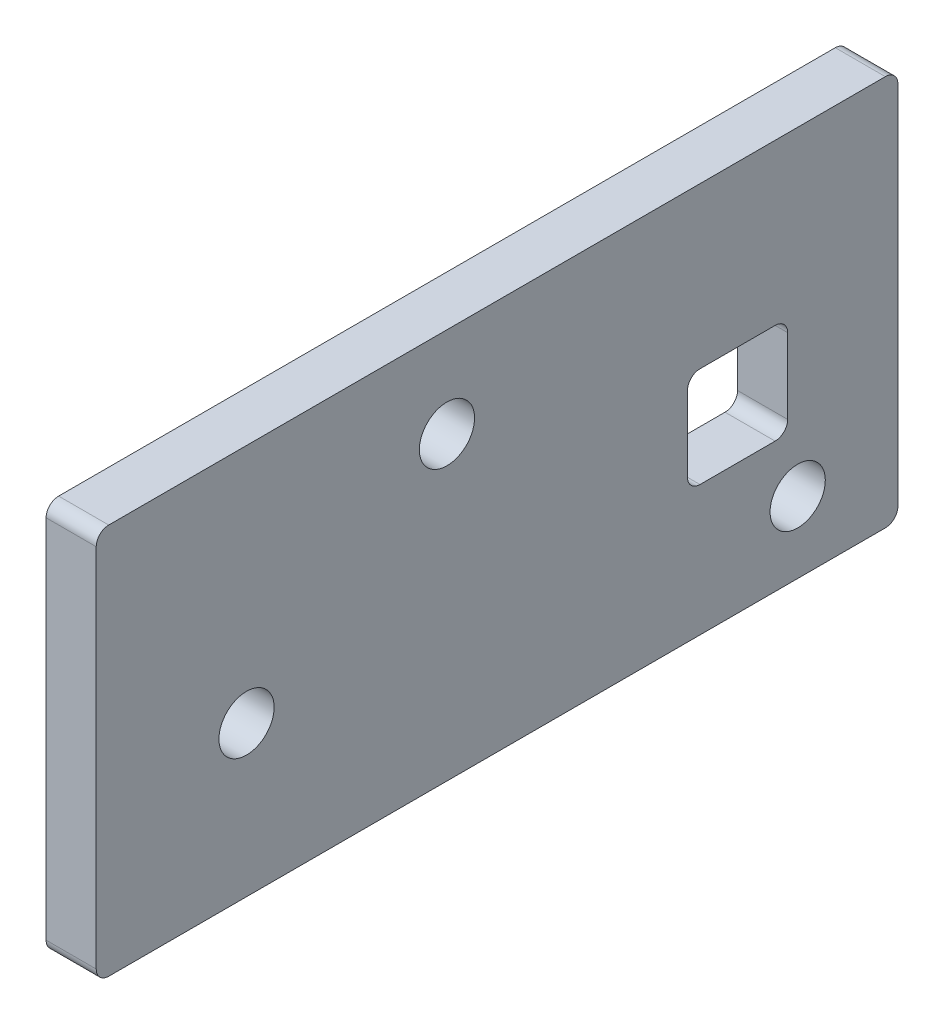
ISO-10303-21;
HEADER;
FILE_DESCRIPTION(('STEP AP214'),'2;1');
FILE_NAME('part.step','',(''),(''),'','','');
FILE_SCHEMA(('AUTOMOTIVE_DESIGN { 1 0 10303 214 1 1 1 1 }'));
ENDSEC;
DATA;
#1=APPLICATION_CONTEXT('core data for automotive mechanical design processes');
#2=APPLICATION_PROTOCOL_DEFINITION('international standard','automotive_design',2000,#1);
#3=PRODUCT_CONTEXT('',#1,'mechanical');
#4=PRODUCT('Part','Part','',(#3));
#5=PRODUCT_RELATED_PRODUCT_CATEGORY('part','',(#4));
#6=PRODUCT_DEFINITION_FORMATION('','',#4);
#7=PRODUCT_DEFINITION_CONTEXT('part definition',#1,'design');
#8=PRODUCT_DEFINITION('design','',#6,#7);
#9=PRODUCT_DEFINITION_SHAPE('','',#8);
#10=(LENGTH_UNIT() NAMED_UNIT(*) SI_UNIT(.MILLI.,.METRE.));
#11=(NAMED_UNIT(*) PLANE_ANGLE_UNIT() SI_UNIT($,.RADIAN.));
#12=(NAMED_UNIT(*) SI_UNIT($,.STERADIAN.) SOLID_ANGLE_UNIT());
#13=UNCERTAINTY_MEASURE_WITH_UNIT(LENGTH_MEASURE(1.E-05),#10,'distance_accuracy_value','');
#14=(GEOMETRIC_REPRESENTATION_CONTEXT(3) GLOBAL_UNCERTAINTY_ASSIGNED_CONTEXT((#13)) GLOBAL_UNIT_ASSIGNED_CONTEXT((#10,
#11,#12)) REPRESENTATION_CONTEXT('',''));
#15=CARTESIAN_POINT('',(0.,0.,0.));
#16=DIRECTION('',(0.,0.,1.));
#17=DIRECTION('',(1.,0.,0.));
#18=AXIS2_PLACEMENT_3D('',#15,#16,#17);
#19=CARTESIAN_POINT('',(3.175,0.,-2.54));
#20=DIRECTION('',(0.,0.,1.));
#21=DIRECTION('',(1.,0.,0.));
#22=AXIS2_PLACEMENT_3D('',#19,#20,#21);
#23=PLANE('',#22);
#24=DIRECTION('',(0.,1.,0.));
#25=VECTOR('',#24,1.);
#26=CARTESIAN_POINT('',(0.,0.,-2.54));
#27=LINE('',#26,#25);
#28=CARTESIAN_POINT('',(0.,-22.70125,-2.54));
#29=VERTEX_POINT('',#28);
#30=CARTESIAN_POINT('',(0.,-17.93875,-2.54));
#31=VERTEX_POINT('',#30);
#32=EDGE_CURVE('E245',#29,#31,#27,.T.);
#33=ORIENTED_EDGE('',*,*,#32,.T.);
#34=DIRECTION('',(-1.,0.,0.));
#35=VECTOR('',#34,1.);
#36=CARTESIAN_POINT('',(3.175,-17.93875,-2.54));
#37=LINE('',#36,#35);
#38=CARTESIAN_POINT('',(3.175,-17.93875,-2.54));
#39=VERTEX_POINT('',#38);
#40=EDGE_CURVE('E197',#31,#39,#37,.F.);
#41=ORIENTED_EDGE('',*,*,#40,.T.);
#42=DIRECTION('',(0.,1.,0.));
#43=VECTOR('',#42,1.);
#44=CARTESIAN_POINT('',(3.175,0.,-2.54));
#45=LINE('',#44,#43);
#46=CARTESIAN_POINT('',(3.175,-22.70125,-2.54));
#47=VERTEX_POINT('',#46);
#48=EDGE_CURVE('E259',#47,#39,#45,.T.);
#49=ORIENTED_EDGE('',*,*,#48,.F.);
#50=DIRECTION('',(-1.,0.,0.));
#51=VECTOR('',#50,1.);
#52=CARTESIAN_POINT('',(3.175,-22.70125,-2.54));
#53=LINE('',#52,#51);
#54=EDGE_CURVE('E194',#47,#29,#53,.T.);
#55=ORIENTED_EDGE('',*,*,#54,.T.);
#56=EDGE_LOOP('',(#33,#41,#49,#55));
#57=FACE_BOUND('',#56,.T.);
#58=ADVANCED_FACE('F41',(#57),#23,.F.);
#59=CARTESIAN_POINT('',(3.175,-17.145,0.));
#60=DIRECTION('',(0.,1.,0.));
#61=DIRECTION('',(0.,0.,1.));
#62=AXIS2_PLACEMENT_3D('',#59,#60,#61);
#63=PLANE('',#62);
#64=DIRECTION('',(0.,0.,-1.));
#65=VECTOR('',#64,1.);
#66=CARTESIAN_POINT('',(0.,-17.145,0.));
#67=LINE('',#66,#65);
#68=CARTESIAN_POINT('',(0.,-17.145,-3.33375));
#69=VERTEX_POINT('',#68);
#70=CARTESIAN_POINT('',(0.,-17.145,-8.09625));
#71=VERTEX_POINT('',#70);
#72=EDGE_CURVE('E177',#69,#71,#67,.T.);
#73=ORIENTED_EDGE('',*,*,#72,.T.);
#74=DIRECTION('',(-1.,0.,0.));
#75=VECTOR('',#74,1.);
#76=CARTESIAN_POINT('',(3.175,-17.145,-8.09625));
#77=LINE('',#76,#75);
#78=CARTESIAN_POINT('',(3.175,-17.145,-8.09625));
#79=VERTEX_POINT('',#78);
#80=EDGE_CURVE('E192',#71,#79,#77,.F.);
#81=ORIENTED_EDGE('',*,*,#80,.T.);
#82=DIRECTION('',(0.,0.,-1.));
#83=VECTOR('',#82,1.);
#84=CARTESIAN_POINT('',(3.175,-17.145,0.));
#85=LINE('',#84,#83);
#86=CARTESIAN_POINT('',(3.175,-17.145,-3.33375));
#87=VERTEX_POINT('',#86);
#88=EDGE_CURVE('E263',#87,#79,#85,.T.);
#89=ORIENTED_EDGE('',*,*,#88,.F.);
#90=DIRECTION('',(-1.,0.,0.));
#91=VECTOR('',#90,1.);
#92=CARTESIAN_POINT('',(0.,-17.145,-3.33375));
#93=LINE('',#92,#91);
#94=EDGE_CURVE('E183',#87,#69,#93,.T.);
#95=ORIENTED_EDGE('',*,*,#94,.T.);
#96=EDGE_LOOP('',(#73,#81,#89,#95));
#97=FACE_BOUND('',#96,.T.);
#98=ADVANCED_FACE('F298',(#97),#63,.F.);
#99=CARTESIAN_POINT('',(3.175,0.,-8.89));
#100=DIRECTION('',(0.,0.,1.));
#101=DIRECTION('',(1.,0.,0.));
#102=AXIS2_PLACEMENT_3D('',#99,#100,#101);
#103=PLANE('',#102);
#104=DIRECTION('',(0.,1.,0.));
#105=VECTOR('',#104,1.);
#106=CARTESIAN_POINT('',(3.175,0.,-8.89));
#107=LINE('',#106,#105);
#108=CARTESIAN_POINT('',(3.175,-22.70125,-8.89));
#109=VERTEX_POINT('',#108);
#110=CARTESIAN_POINT('',(3.175,-17.93875,-8.89));
#111=VERTEX_POINT('',#110);
#112=EDGE_CURVE('E186',#109,#111,#107,.T.);
#113=ORIENTED_EDGE('',*,*,#112,.T.);
#114=DIRECTION('',(-1.,0.,0.));
#115=VECTOR('',#114,1.);
#116=CARTESIAN_POINT('',(3.175,-17.93875,-8.89));
#117=LINE('',#116,#115);
#118=CARTESIAN_POINT('',(0.,-17.93875,-8.89));
#119=VERTEX_POINT('',#118);
#120=EDGE_CURVE('E176',#111,#119,#117,.T.);
#121=ORIENTED_EDGE('',*,*,#120,.T.);
#122=DIRECTION('',(0.,1.,0.));
#123=VECTOR('',#122,1.);
#124=CARTESIAN_POINT('',(0.,0.,-8.89));
#125=LINE('',#124,#123);
#126=CARTESIAN_POINT('',(0.,-22.70125,-8.89));
#127=VERTEX_POINT('',#126);
#128=EDGE_CURVE('E159',#127,#119,#125,.T.);
#129=ORIENTED_EDGE('',*,*,#128,.F.);
#130=DIRECTION('',(-1.,0.,0.));
#131=VECTOR('',#130,1.);
#132=CARTESIAN_POINT('',(3.175,-22.70125,-8.89));
#133=LINE('',#132,#131);
#134=EDGE_CURVE('E173',#127,#109,#133,.F.);
#135=ORIENTED_EDGE('',*,*,#134,.T.);
#136=EDGE_LOOP('',(#113,#121,#129,#135));
#137=FACE_BOUND('',#136,.T.);
#138=ADVANCED_FACE('F172',(#137),#103,.T.);
#139=CARTESIAN_POINT('',(3.175,-6.985,0.));
#140=DIRECTION('',(0.,1.,0.));
#141=DIRECTION('',(0.,0.,1.));
#142=AXIS2_PLACEMENT_3D('',#139,#140,#141);
#143=PLANE('',#142);
#144=DIRECTION('',(0.,0.,-1.));
#145=VECTOR('',#144,1.);
#146=CARTESIAN_POINT('',(0.,-6.985,0.));
#147=LINE('',#146,#145);
#148=CARTESIAN_POINT('',(0.,-6.985,34.13125));
#149=VERTEX_POINT('',#148);
#150=CARTESIAN_POINT('',(0.,-6.98499999999999,-15.08125));
#151=VERTEX_POINT('',#150);
#152=EDGE_CURVE('E282',#149,#151,#147,.T.);
#153=ORIENTED_EDGE('',*,*,#152,.F.);
#154=DIRECTION('',(-1.,0.,0.));
#155=VECTOR('',#154,1.);
#156=CARTESIAN_POINT('',(3.175,-6.985,34.13125));
#157=LINE('',#156,#155);
#158=CARTESIAN_POINT('',(3.175,-6.985,34.13125));
#159=VERTEX_POINT('',#158);
#160=EDGE_CURVE('E231',#149,#159,#157,.F.);
#161=ORIENTED_EDGE('',*,*,#160,.T.);
#162=DIRECTION('',(0.,0.,-1.));
#163=VECTOR('',#162,1.);
#164=CARTESIAN_POINT('',(3.175,-6.985,0.));
#165=LINE('',#164,#163);
#166=CARTESIAN_POINT('',(3.175,-6.98499999999999,-15.08125));
#167=VERTEX_POINT('',#166);
#168=EDGE_CURVE('E380',#159,#167,#165,.T.);
#169=ORIENTED_EDGE('',*,*,#168,.T.);
#170=DIRECTION('',(-1.,0.,0.));
#171=VECTOR('',#170,1.);
#172=CARTESIAN_POINT('',(0.,-6.98499999999999,-15.08125));
#173=LINE('',#172,#171);
#174=EDGE_CURVE('E228',#167,#151,#173,.T.);
#175=ORIENTED_EDGE('',*,*,#174,.T.);
#176=EDGE_LOOP('',(#153,#161,#169,#175));
#177=FACE_BOUND('',#176,.T.);
#178=ADVANCED_FACE('F334',(#177),#143,.T.);
#179=CARTESIAN_POINT('',(3.175,0.,34.925));
#180=DIRECTION('',(0.,0.,-1.));
#181=DIRECTION('',(0.,1.,0.));
#182=AXIS2_PLACEMENT_3D('',#179,#180,#181);
#183=PLANE('',#182);
#184=DIRECTION('',(0.,-1.,0.));
#185=VECTOR('',#184,1.);
#186=CARTESIAN_POINT('',(0.,0.,34.925));
#187=LINE('',#186,#185);
#188=CARTESIAN_POINT('',(0.,-7.77875,34.925));
#189=VERTEX_POINT('',#188);
#190=CARTESIAN_POINT('',(0.,-30.95625,34.925));
#191=VERTEX_POINT('',#190);
#192=EDGE_CURVE('E285',#189,#191,#187,.T.);
#193=ORIENTED_EDGE('',*,*,#192,.T.);
#194=DIRECTION('',(-1.,0.,0.));
#195=VECTOR('',#194,1.);
#196=CARTESIAN_POINT('',(3.175,-30.95625,34.925));
#197=LINE('',#196,#195);
#198=CARTESIAN_POINT('',(3.175,-30.95625,34.925));
#199=VERTEX_POINT('',#198);
#200=EDGE_CURVE('E219',#191,#199,#197,.F.);
#201=ORIENTED_EDGE('',*,*,#200,.T.);
#202=DIRECTION('',(0.,-1.,0.));
#203=VECTOR('',#202,1.);
#204=CARTESIAN_POINT('',(3.175,0.,34.925));
#205=LINE('',#204,#203);
#206=CARTESIAN_POINT('',(3.175,-7.77875,34.925));
#207=VERTEX_POINT('',#206);
#208=EDGE_CURVE('E382',#207,#199,#205,.T.);
#209=ORIENTED_EDGE('',*,*,#208,.F.);
#210=DIRECTION('',(-1.,0.,0.));
#211=VECTOR('',#210,1.);
#212=CARTESIAN_POINT('',(0.,-7.77875,34.925));
#213=LINE('',#212,#211);
#214=EDGE_CURVE('E216',#207,#189,#213,.T.);
#215=ORIENTED_EDGE('',*,*,#214,.T.);
#216=EDGE_LOOP('',(#193,#201,#209,#215));
#217=FACE_BOUND('',#216,.T.);
#218=ADVANCED_FACE('F330',(#217),#183,.F.);
#219=CARTESIAN_POINT('',(3.175,-31.75,0.));
#220=DIRECTION('',(0.,-1.,0.));
#221=DIRECTION('',(0.,0.,-1.));
#222=AXIS2_PLACEMENT_3D('',#219,#220,#221);
#223=PLANE('',#222);
#224=DIRECTION('',(0.,0.,1.));
#225=VECTOR('',#224,1.);
#226=CARTESIAN_POINT('',(3.175,-31.75,0.));
#227=LINE('',#226,#225);
#228=CARTESIAN_POINT('',(3.175,-31.75,-15.08125));
#229=VERTEX_POINT('',#228);
#230=CARTESIAN_POINT('',(3.175,-31.75,34.13125));
#231=VERTEX_POINT('',#230);
#232=EDGE_CURVE('E268',#229,#231,#227,.T.);
#233=ORIENTED_EDGE('',*,*,#232,.T.);
#234=DIRECTION('',(-1.,0.,0.));
#235=VECTOR('',#234,1.);
#236=CARTESIAN_POINT('',(0.,-31.75,34.13125));
#237=LINE('',#236,#235);
#238=CARTESIAN_POINT('',(0.,-31.75,34.13125));
#239=VERTEX_POINT('',#238);
#240=EDGE_CURVE('E205',#231,#239,#237,.T.);
#241=ORIENTED_EDGE('',*,*,#240,.T.);
#242=DIRECTION('',(0.,0.,1.));
#243=VECTOR('',#242,1.);
#244=CARTESIAN_POINT('',(0.,-31.75,0.));
#245=LINE('',#244,#243);
#246=CARTESIAN_POINT('',(0.,-31.75,-15.08125));
#247=VERTEX_POINT('',#246);
#248=EDGE_CURVE('E288',#247,#239,#245,.T.);
#249=ORIENTED_EDGE('',*,*,#248,.F.);
#250=DIRECTION('',(-1.,0.,0.));
#251=VECTOR('',#250,1.);
#252=CARTESIAN_POINT('',(3.175,-31.75,-15.08125));
#253=LINE('',#252,#251);
#254=EDGE_CURVE('E203',#247,#229,#253,.F.);
#255=ORIENTED_EDGE('',*,*,#254,.T.);
#256=EDGE_LOOP('',(#233,#241,#249,#255));
#257=FACE_BOUND('',#256,.T.);
#258=ADVANCED_FACE('F327',(#257),#223,.T.);
#259=CARTESIAN_POINT('',(3.175,0.,-15.875));
#260=DIRECTION('',(0.,0.,1.));
#261=DIRECTION('',(1.,0.,0.));
#262=AXIS2_PLACEMENT_3D('',#259,#260,#261);
#263=PLANE('',#262);
#264=DIRECTION('',(0.,1.,0.));
#265=VECTOR('',#264,1.);
#266=CARTESIAN_POINT('',(0.,0.,-15.875));
#267=LINE('',#266,#265);
#268=CARTESIAN_POINT('',(0.,-30.95625,-15.875));
#269=VERTEX_POINT('',#268);
#270=CARTESIAN_POINT('',(0.,-7.77875,-15.875));
#271=VERTEX_POINT('',#270);
#272=EDGE_CURVE('E291',#269,#271,#267,.T.);
#273=ORIENTED_EDGE('',*,*,#272,.T.);
#274=DIRECTION('',(-1.,0.,0.));
#275=VECTOR('',#274,1.);
#276=CARTESIAN_POINT('',(3.175,-7.77875,-15.875));
#277=LINE('',#276,#275);
#278=CARTESIAN_POINT('',(3.175,-7.77875,-15.875));
#279=VERTEX_POINT('',#278);
#280=EDGE_CURVE('E56',#271,#279,#277,.F.);
#281=ORIENTED_EDGE('',*,*,#280,.T.);
#282=DIRECTION('',(0.,1.,0.));
#283=VECTOR('',#282,1.);
#284=CARTESIAN_POINT('',(3.175,0.,-15.875));
#285=LINE('',#284,#283);
#286=CARTESIAN_POINT('',(3.175,-30.95625,-15.875));
#287=VERTEX_POINT('',#286);
#288=EDGE_CURVE('E264',#287,#279,#285,.T.);
#289=ORIENTED_EDGE('',*,*,#288,.F.);
#290=DIRECTION('',(-1.,0.,0.));
#291=VECTOR('',#290,1.);
#292=CARTESIAN_POINT('',(0.,-30.95625,-15.875));
#293=LINE('',#292,#291);
#294=EDGE_CURVE('E233',#287,#269,#293,.T.);
#295=ORIENTED_EDGE('',*,*,#294,.T.);
#296=EDGE_LOOP('',(#273,#281,#289,#295));
#297=FACE_BOUND('',#296,.T.);
#298=ADVANCED_FACE('F323',(#297),#263,.F.);
#299=CARTESIAN_POINT('',(3.175,-27.225,-9.52500000000001));
#300=DIRECTION('',(-1.,0.,0.));
#301=DIRECTION('',(0.,0.,1.));
#302=AXIS2_PLACEMENT_3D('',#299,#300,#301);
#303=CYLINDRICAL_SURFACE('',#302,1.75);
#304=CARTESIAN_POINT('',(3.175,-27.225,-9.52500000000001));
#305=DIRECTION('',(1.,0.,0.));
#306=DIRECTION('',(0.,0.,-1.));
#307=AXIS2_PLACEMENT_3D('',#304,#305,#306);
#308=CIRCLE('',#307,1.75);
#309=CARTESIAN_POINT('',(3.175,-27.225,-11.275));
#310=VERTEX_POINT('',#309);
#311=EDGE_CURVE('E383',#310,#310,#308,.T.);
#312=ORIENTED_EDGE('',*,*,#311,.T.);
#313=EDGE_LOOP('',(#312));
#314=FACE_BOUND('',#313,.T.);
#315=CARTESIAN_POINT('',(0.,-27.225,-9.52500000000001));
#316=DIRECTION('',(1.,0.,0.));
#317=DIRECTION('',(0.,0.,-1.));
#318=AXIS2_PLACEMENT_3D('',#315,#316,#317);
#319=CIRCLE('',#318,1.75);
#320=CARTESIAN_POINT('',(0.,-27.225,-11.275));
#321=VERTEX_POINT('',#320);
#322=EDGE_CURVE('E279',#321,#321,#319,.T.);
#323=ORIENTED_EDGE('',*,*,#322,.F.);
#324=EDGE_LOOP('',(#323));
#325=FACE_BOUND('',#324,.T.);
#326=ADVANCED_FACE('F326',(#314,#325),#303,.F.);
#327=CARTESIAN_POINT('',(3.175,-22.225,25.4));
#328=DIRECTION('',(-1.,0.,0.));
#329=DIRECTION('',(0.,0.,1.));
#330=AXIS2_PLACEMENT_3D('',#327,#328,#329);
#331=CYLINDRICAL_SURFACE('',#330,1.75);
#332=CARTESIAN_POINT('',(3.175,-22.225,25.4));
#333=DIRECTION('',(1.,0.,0.));
#334=DIRECTION('',(0.,0.,-1.));
#335=AXIS2_PLACEMENT_3D('',#332,#333,#334);
#336=CIRCLE('',#335,1.75);
#337=CARTESIAN_POINT('',(3.175,-22.225,23.65));
#338=VERTEX_POINT('',#337);
#339=EDGE_CURVE('E388',#338,#338,#336,.T.);
#340=ORIENTED_EDGE('',*,*,#339,.T.);
#341=EDGE_LOOP('',(#340));
#342=FACE_BOUND('',#341,.T.);
#343=CARTESIAN_POINT('',(0.,-22.225,25.4));
#344=DIRECTION('',(1.,0.,0.));
#345=DIRECTION('',(0.,0.,-1.));
#346=AXIS2_PLACEMENT_3D('',#343,#344,#345);
#347=CIRCLE('',#346,1.75);
#348=CARTESIAN_POINT('',(0.,-22.225,23.65));
#349=VERTEX_POINT('',#348);
#350=EDGE_CURVE('E276',#349,#349,#347,.T.);
#351=ORIENTED_EDGE('',*,*,#350,.F.);
#352=EDGE_LOOP('',(#351));
#353=FACE_BOUND('',#352,.T.);
#354=ADVANCED_FACE('F341',(#342,#353),#331,.F.);
#355=CARTESIAN_POINT('',(3.175,-12.7,12.7));
#356=DIRECTION('',(-1.,0.,0.));
#357=DIRECTION('',(0.,0.,1.));
#358=AXIS2_PLACEMENT_3D('',#355,#356,#357);
#359=CYLINDRICAL_SURFACE('',#358,1.75);
#360=CARTESIAN_POINT('',(3.175,-12.7,12.7));
#361=DIRECTION('',(1.,0.,0.));
#362=DIRECTION('',(0.,0.,-1.));
#363=AXIS2_PLACEMENT_3D('',#360,#361,#362);
#364=CIRCLE('',#363,1.75);
#365=CARTESIAN_POINT('',(3.175,-12.7,10.95));
#366=VERTEX_POINT('',#365);
#367=EDGE_CURVE('E252',#366,#366,#364,.T.);
#368=ORIENTED_EDGE('',*,*,#367,.T.);
#369=EDGE_LOOP('',(#368));
#370=FACE_BOUND('',#369,.T.);
#371=CARTESIAN_POINT('',(0.,-12.7,12.7));
#372=DIRECTION('',(1.,0.,0.));
#373=DIRECTION('',(0.,0.,-1.));
#374=AXIS2_PLACEMENT_3D('',#371,#372,#373);
#375=CIRCLE('',#374,1.75);
#376=CARTESIAN_POINT('',(0.,-12.7,10.95));
#377=VERTEX_POINT('',#376);
#378=EDGE_CURVE('E273',#377,#377,#375,.T.);
#379=ORIENTED_EDGE('',*,*,#378,.F.);
#380=EDGE_LOOP('',(#379));
#381=FACE_BOUND('',#380,.T.);
#382=ADVANCED_FACE('F345',(#370,#381),#359,.F.);
#383=CARTESIAN_POINT('',(3.175,-23.495,0.));
#384=DIRECTION('',(0.,1.,0.));
#385=DIRECTION('',(0.,0.,1.));
#386=AXIS2_PLACEMENT_3D('',#383,#384,#385);
#387=PLANE('',#386);
#388=DIRECTION('',(0.,0.,-1.));
#389=VECTOR('',#388,1.);
#390=CARTESIAN_POINT('',(3.175,-23.495,0.));
#391=LINE('',#390,#389);
#392=CARTESIAN_POINT('',(3.175,-23.495,-3.33375));
#393=VERTEX_POINT('',#392);
#394=CARTESIAN_POINT('',(3.175,-23.495,-8.09625));
#395=VERTEX_POINT('',#394);
#396=EDGE_CURVE('E181',#393,#395,#391,.T.);
#397=ORIENTED_EDGE('',*,*,#396,.T.);
#398=DIRECTION('',(-1.,0.,0.));
#399=VECTOR('',#398,1.);
#400=CARTESIAN_POINT('',(0.,-23.495,-8.09625));
#401=LINE('',#400,#399);
#402=CARTESIAN_POINT('',(0.,-23.495,-8.09625));
#403=VERTEX_POINT('',#402);
#404=EDGE_CURVE('E201',#395,#403,#401,.T.);
#405=ORIENTED_EDGE('',*,*,#404,.T.);
#406=DIRECTION('',(0.,0.,-1.));
#407=VECTOR('',#406,1.);
#408=CARTESIAN_POINT('',(0.,-23.495,0.));
#409=LINE('',#408,#407);
#410=CARTESIAN_POINT('',(0.,-23.495,-3.33375));
#411=VERTEX_POINT('',#410);
#412=EDGE_CURVE('E161',#411,#403,#409,.T.);
#413=ORIENTED_EDGE('',*,*,#412,.F.);
#414=DIRECTION('',(-1.,0.,0.));
#415=VECTOR('',#414,1.);
#416=CARTESIAN_POINT('',(3.175,-23.495,-3.33375));
#417=LINE('',#416,#415);
#418=EDGE_CURVE('E199',#411,#393,#417,.F.);
#419=ORIENTED_EDGE('',*,*,#418,.T.);
#420=EDGE_LOOP('',(#397,#405,#413,#419));
#421=FACE_BOUND('',#420,.T.);
#422=ADVANCED_FACE('F250',(#421),#387,.T.);
#423=CARTESIAN_POINT('',(3.175,0.,0.));
#424=DIRECTION('',(1.,0.,0.));
#425=DIRECTION('',(0.,0.,-1.));
#426=AXIS2_PLACEMENT_3D('',#423,#424,#425);
#427=PLANE('',#426);
#428=ORIENTED_EDGE('',*,*,#367,.F.);
#429=EDGE_LOOP('',(#428));
#430=FACE_BOUND('',#429,.T.);
#431=ORIENTED_EDGE('',*,*,#339,.F.);
#432=EDGE_LOOP('',(#431));
#433=FACE_BOUND('',#432,.T.);
#434=ORIENTED_EDGE('',*,*,#311,.F.);
#435=EDGE_LOOP('',(#434));
#436=FACE_BOUND('',#435,.T.);
#437=ORIENTED_EDGE('',*,*,#208,.T.);
#438=CARTESIAN_POINT('',(3.175,-30.95625,34.13125));
#439=DIRECTION('',(1.,0.,0.));
#440=DIRECTION('',(0.,0.,-1.));
#441=AXIS2_PLACEMENT_3D('',#438,#439,#440);
#442=CIRCLE('',#441,0.79375);
#443=EDGE_CURVE('E226',#199,#231,#442,.T.);
#444=ORIENTED_EDGE('',*,*,#443,.T.);
#445=ORIENTED_EDGE('',*,*,#232,.F.);
#446=CARTESIAN_POINT('',(3.175,-30.95625,-15.08125));
#447=DIRECTION('',(1.,0.,0.));
#448=DIRECTION('',(0.,0.,-1.));
#449=AXIS2_PLACEMENT_3D('',#446,#447,#448);
#450=CIRCLE('',#449,0.79375);
#451=EDGE_CURVE('E63',#229,#287,#450,.T.);
#452=ORIENTED_EDGE('',*,*,#451,.T.);
#453=ORIENTED_EDGE('',*,*,#288,.T.);
#454=CARTESIAN_POINT('',(3.175,-7.77875,-15.08125));
#455=DIRECTION('',(1.,0.,0.));
#456=DIRECTION('',(0.,0.,-1.));
#457=AXIS2_PLACEMENT_3D('',#454,#455,#456);
#458=CIRCLE('',#457,0.79375);
#459=EDGE_CURVE('E222',#279,#167,#458,.T.);
#460=ORIENTED_EDGE('',*,*,#459,.T.);
#461=ORIENTED_EDGE('',*,*,#168,.F.);
#462=CARTESIAN_POINT('',(3.175,-7.77875,34.13125));
#463=DIRECTION('',(1.,0.,0.));
#464=DIRECTION('',(0.,0.,-1.));
#465=AXIS2_PLACEMENT_3D('',#462,#463,#464);
#466=CIRCLE('',#465,0.79375);
#467=EDGE_CURVE('E224',#159,#207,#466,.T.);
#468=ORIENTED_EDGE('',*,*,#467,.T.);
#469=EDGE_LOOP('',(#437,#444,#445,#452,#453,#460,#461,#468));
#470=FACE_BOUND('',#469,.T.);
#471=ORIENTED_EDGE('',*,*,#396,.F.);
#472=CARTESIAN_POINT('',(3.175,-22.70125,-3.33375));
#473=DIRECTION('',(1.,0.,0.));
#474=DIRECTION('',(0.,0.,-1.));
#475=AXIS2_PLACEMENT_3D('',#472,#473,#474);
#476=CIRCLE('',#475,0.79375);
#477=EDGE_CURVE('E11',#393,#47,#476,.F.);
#478=ORIENTED_EDGE('',*,*,#477,.T.);
#479=ORIENTED_EDGE('',*,*,#48,.T.);
#480=CARTESIAN_POINT('',(3.175,-17.93875,-3.33375));
#481=DIRECTION('',(1.,0.,0.));
#482=DIRECTION('',(0.,0.,-1.));
#483=AXIS2_PLACEMENT_3D('',#480,#481,#482);
#484=CIRCLE('',#483,0.79375);
#485=EDGE_CURVE('E167',#39,#87,#484,.F.);
#486=ORIENTED_EDGE('',*,*,#485,.T.);
#487=ORIENTED_EDGE('',*,*,#88,.T.);
#488=CARTESIAN_POINT('',(3.175,-17.93875,-8.09625));
#489=DIRECTION('',(1.,0.,0.));
#490=DIRECTION('',(0.,0.,-1.));
#491=AXIS2_PLACEMENT_3D('',#488,#489,#490);
#492=CIRCLE('',#491,0.79375);
#493=EDGE_CURVE('E239',#79,#111,#492,.F.);
#494=ORIENTED_EDGE('',*,*,#493,.T.);
#495=ORIENTED_EDGE('',*,*,#112,.F.);
#496=CARTESIAN_POINT('',(3.175,-22.70125,-8.09625));
#497=DIRECTION('',(1.,0.,0.));
#498=DIRECTION('',(0.,0.,-1.));
#499=AXIS2_PLACEMENT_3D('',#496,#497,#498);
#500=CIRCLE('',#499,0.79375);
#501=EDGE_CURVE('E166',#109,#395,#500,.F.);
#502=ORIENTED_EDGE('',*,*,#501,.T.);
#503=EDGE_LOOP('',(#471,#478,#479,#486,#487,#494,#495,#502));
#504=FACE_BOUND('',#503,.T.);
#505=ADVANCED_FACE('F258',(#430,#433,#436,#470,#504),#427,.T.);
#506=CARTESIAN_POINT('',(0.,0.,0.));
#507=DIRECTION('',(1.,0.,0.));
#508=DIRECTION('',(0.,0.,-1.));
#509=AXIS2_PLACEMENT_3D('',#506,#507,#508);
#510=PLANE('',#509);
#511=ORIENTED_EDGE('',*,*,#378,.T.);
#512=EDGE_LOOP('',(#511));
#513=FACE_BOUND('',#512,.T.);
#514=ORIENTED_EDGE('',*,*,#350,.T.);
#515=EDGE_LOOP('',(#514));
#516=FACE_BOUND('',#515,.T.);
#517=ORIENTED_EDGE('',*,*,#322,.T.);
#518=EDGE_LOOP('',(#517));
#519=FACE_BOUND('',#518,.T.);
#520=ORIENTED_EDGE('',*,*,#248,.T.);
#521=CARTESIAN_POINT('',(0.,-30.95625,34.13125));
#522=DIRECTION('',(1.,0.,0.));
#523=DIRECTION('',(0.,0.,-1.));
#524=AXIS2_PLACEMENT_3D('',#521,#522,#523);
#525=CIRCLE('',#524,0.79375);
#526=EDGE_CURVE('E214',#239,#191,#525,.F.);
#527=ORIENTED_EDGE('',*,*,#526,.T.);
#528=ORIENTED_EDGE('',*,*,#192,.F.);
#529=CARTESIAN_POINT('',(0.,-7.77875,34.13125));
#530=DIRECTION('',(1.,0.,0.));
#531=DIRECTION('',(0.,0.,-1.));
#532=AXIS2_PLACEMENT_3D('',#529,#530,#531);
#533=CIRCLE('',#532,0.79375);
#534=EDGE_CURVE('E212',#189,#149,#533,.F.);
#535=ORIENTED_EDGE('',*,*,#534,.T.);
#536=ORIENTED_EDGE('',*,*,#152,.T.);
#537=CARTESIAN_POINT('',(0.,-7.77875,-15.08125));
#538=DIRECTION('',(1.,0.,0.));
#539=DIRECTION('',(0.,0.,-1.));
#540=AXIS2_PLACEMENT_3D('',#537,#538,#539);
#541=CIRCLE('',#540,0.79375);
#542=EDGE_CURVE('E210',#151,#271,#541,.F.);
#543=ORIENTED_EDGE('',*,*,#542,.T.);
#544=ORIENTED_EDGE('',*,*,#272,.F.);
#545=CARTESIAN_POINT('',(0.,-30.95625,-15.08125));
#546=DIRECTION('',(1.,0.,0.));
#547=DIRECTION('',(0.,0.,-1.));
#548=AXIS2_PLACEMENT_3D('',#545,#546,#547);
#549=CIRCLE('',#548,0.79375);
#550=EDGE_CURVE('E208',#269,#247,#549,.F.);
#551=ORIENTED_EDGE('',*,*,#550,.T.);
#552=EDGE_LOOP('',(#520,#527,#528,#535,#536,#543,#544,#551));
#553=FACE_BOUND('',#552,.T.);
#554=ORIENTED_EDGE('',*,*,#32,.F.);
#555=CARTESIAN_POINT('',(0.,-22.70125,-3.33375));
#556=DIRECTION('',(1.,0.,0.));
#557=DIRECTION('',(0.,0.,-1.));
#558=AXIS2_PLACEMENT_3D('',#555,#556,#557);
#559=CIRCLE('',#558,0.79375);
#560=EDGE_CURVE('E49',#29,#411,#559,.T.);
#561=ORIENTED_EDGE('',*,*,#560,.T.);
#562=ORIENTED_EDGE('',*,*,#412,.T.);
#563=CARTESIAN_POINT('',(0.,-22.70125,-8.09625));
#564=DIRECTION('',(1.,0.,0.));
#565=DIRECTION('',(0.,0.,-1.));
#566=AXIS2_PLACEMENT_3D('',#563,#564,#565);
#567=CIRCLE('',#566,0.79375);
#568=EDGE_CURVE('E155',#403,#127,#567,.T.);
#569=ORIENTED_EDGE('',*,*,#568,.T.);
#570=ORIENTED_EDGE('',*,*,#128,.T.);
#571=CARTESIAN_POINT('',(0.,-17.93875,-8.09625));
#572=DIRECTION('',(1.,0.,0.));
#573=DIRECTION('',(0.,0.,-1.));
#574=AXIS2_PLACEMENT_3D('',#571,#572,#573);
#575=CIRCLE('',#574,0.79375);
#576=EDGE_CURVE('E237',#119,#71,#575,.T.);
#577=ORIENTED_EDGE('',*,*,#576,.T.);
#578=ORIENTED_EDGE('',*,*,#72,.F.);
#579=CARTESIAN_POINT('',(0.,-17.93875,-3.33375));
#580=DIRECTION('',(1.,0.,0.));
#581=DIRECTION('',(0.,0.,-1.));
#582=AXIS2_PLACEMENT_3D('',#579,#580,#581);
#583=CIRCLE('',#582,0.79375);
#584=EDGE_CURVE('E241',#69,#31,#583,.T.);
#585=ORIENTED_EDGE('',*,*,#584,.T.);
#586=EDGE_LOOP('',(#554,#561,#562,#569,#570,#577,#578,#585));
#587=FACE_BOUND('',#586,.T.);
#588=ADVANCED_FACE('F158',(#513,#516,#519,#553,#587),#510,.F.);
#589=CARTESIAN_POINT('',(3.175,-17.93875,-8.09625));
#590=DIRECTION('',(-1.,0.,0.));
#591=DIRECTION('',(0.,0.,1.));
#592=AXIS2_PLACEMENT_3D('',#589,#590,#591);
#593=CYLINDRICAL_SURFACE('',#592,0.79375);
#594=ORIENTED_EDGE('',*,*,#493,.F.);
#595=ORIENTED_EDGE('',*,*,#80,.F.);
#596=ORIENTED_EDGE('',*,*,#576,.F.);
#597=ORIENTED_EDGE('',*,*,#120,.F.);
#598=EDGE_LOOP('',(#594,#595,#596,#597));
#599=FACE_BOUND('',#598,.T.);
#600=ADVANCED_FACE('F303',(#599),#593,.F.);
#601=CARTESIAN_POINT('',(3.175,-17.93875,-3.33375));
#602=DIRECTION('',(1.,0.,0.));
#603=DIRECTION('',(0.,0.,-1.));
#604=AXIS2_PLACEMENT_3D('',#601,#602,#603);
#605=CYLINDRICAL_SURFACE('',#604,0.79375);
#606=ORIENTED_EDGE('',*,*,#485,.F.);
#607=ORIENTED_EDGE('',*,*,#40,.F.);
#608=ORIENTED_EDGE('',*,*,#584,.F.);
#609=ORIENTED_EDGE('',*,*,#94,.F.);
#610=EDGE_LOOP('',(#606,#607,#608,#609));
#611=FACE_BOUND('',#610,.T.);
#612=ADVANCED_FACE('F305',(#611),#605,.F.);
#613=CARTESIAN_POINT('',(3.175,-22.70125,-8.09625));
#614=DIRECTION('',(1.,0.,0.));
#615=DIRECTION('',(0.,0.,-1.));
#616=AXIS2_PLACEMENT_3D('',#613,#614,#615);
#617=CYLINDRICAL_SURFACE('',#616,0.79375);
#618=ORIENTED_EDGE('',*,*,#501,.F.);
#619=ORIENTED_EDGE('',*,*,#134,.F.);
#620=ORIENTED_EDGE('',*,*,#568,.F.);
#621=ORIENTED_EDGE('',*,*,#404,.F.);
#622=EDGE_LOOP('',(#618,#619,#620,#621));
#623=FACE_BOUND('',#622,.T.);
#624=ADVANCED_FACE('F180',(#623),#617,.F.);
#625=CARTESIAN_POINT('',(3.175,-22.70125,-3.33375));
#626=DIRECTION('',(-1.,0.,0.));
#627=DIRECTION('',(0.,0.,1.));
#628=AXIS2_PLACEMENT_3D('',#625,#626,#627);
#629=CYLINDRICAL_SURFACE('',#628,0.79375);
#630=ORIENTED_EDGE('',*,*,#477,.F.);
#631=ORIENTED_EDGE('',*,*,#418,.F.);
#632=ORIENTED_EDGE('',*,*,#560,.F.);
#633=ORIENTED_EDGE('',*,*,#54,.F.);
#634=EDGE_LOOP('',(#630,#631,#632,#633));
#635=FACE_BOUND('',#634,.T.);
#636=ADVANCED_FACE('F254',(#635),#629,.F.);
#637=CARTESIAN_POINT('',(3.175,-30.95625,34.13125));
#638=DIRECTION('',(1.,0.,0.));
#639=DIRECTION('',(0.,0.,-1.));
#640=AXIS2_PLACEMENT_3D('',#637,#638,#639);
#641=CYLINDRICAL_SURFACE('',#640,0.79375);
#642=ORIENTED_EDGE('',*,*,#443,.F.);
#643=ORIENTED_EDGE('',*,*,#200,.F.);
#644=ORIENTED_EDGE('',*,*,#526,.F.);
#645=ORIENTED_EDGE('',*,*,#240,.F.);
#646=EDGE_LOOP('',(#642,#643,#644,#645));
#647=FACE_BOUND('',#646,.T.);
#648=ADVANCED_FACE('F393',(#647),#641,.T.);
#649=CARTESIAN_POINT('',(3.175,-7.77875,34.13125));
#650=DIRECTION('',(1.,0.,0.));
#651=DIRECTION('',(0.,0.,-1.));
#652=AXIS2_PLACEMENT_3D('',#649,#650,#651);
#653=CYLINDRICAL_SURFACE('',#652,0.79375);
#654=ORIENTED_EDGE('',*,*,#467,.F.);
#655=ORIENTED_EDGE('',*,*,#160,.F.);
#656=ORIENTED_EDGE('',*,*,#534,.F.);
#657=ORIENTED_EDGE('',*,*,#214,.F.);
#658=EDGE_LOOP('',(#654,#655,#656,#657));
#659=FACE_BOUND('',#658,.T.);
#660=ADVANCED_FACE('F398',(#659),#653,.T.);
#661=CARTESIAN_POINT('',(3.175,-7.77875,-15.08125));
#662=DIRECTION('',(1.,0.,0.));
#663=DIRECTION('',(0.,0.,-1.));
#664=AXIS2_PLACEMENT_3D('',#661,#662,#663);
#665=CYLINDRICAL_SURFACE('',#664,0.79375);
#666=ORIENTED_EDGE('',*,*,#459,.F.);
#667=ORIENTED_EDGE('',*,*,#280,.F.);
#668=ORIENTED_EDGE('',*,*,#542,.F.);
#669=ORIENTED_EDGE('',*,*,#174,.F.);
#670=EDGE_LOOP('',(#666,#667,#668,#669));
#671=FACE_BOUND('',#670,.T.);
#672=ADVANCED_FACE('F376',(#671),#665,.T.);
#673=CARTESIAN_POINT('',(3.175,-30.95625,-15.08125));
#674=DIRECTION('',(1.,0.,0.));
#675=DIRECTION('',(0.,0.,-1.));
#676=AXIS2_PLACEMENT_3D('',#673,#674,#675);
#677=CYLINDRICAL_SURFACE('',#676,0.79375);
#678=ORIENTED_EDGE('',*,*,#451,.F.);
#679=ORIENTED_EDGE('',*,*,#254,.F.);
#680=ORIENTED_EDGE('',*,*,#550,.F.);
#681=ORIENTED_EDGE('',*,*,#294,.F.);
#682=EDGE_LOOP('',(#678,#679,#680,#681));
#683=FACE_BOUND('',#682,.T.);
#684=ADVANCED_FACE('F43',(#683),#677,.T.);
#685=CLOSED_SHELL('',(#58,#98,#138,#178,#218,#258,#298,#326,#354,#382,#422,#505,#588,#600,#612,
#624,#636,#648,#660,#672,#684));
#686=MANIFOLD_SOLID_BREP('B2',#685);
#687=ADVANCED_BREP_SHAPE_REPRESENTATION('',(#18,#686),#14);
#688=SHAPE_DEFINITION_REPRESENTATION(#9,#687);
ENDSEC;
END-ISO-10303-21;
